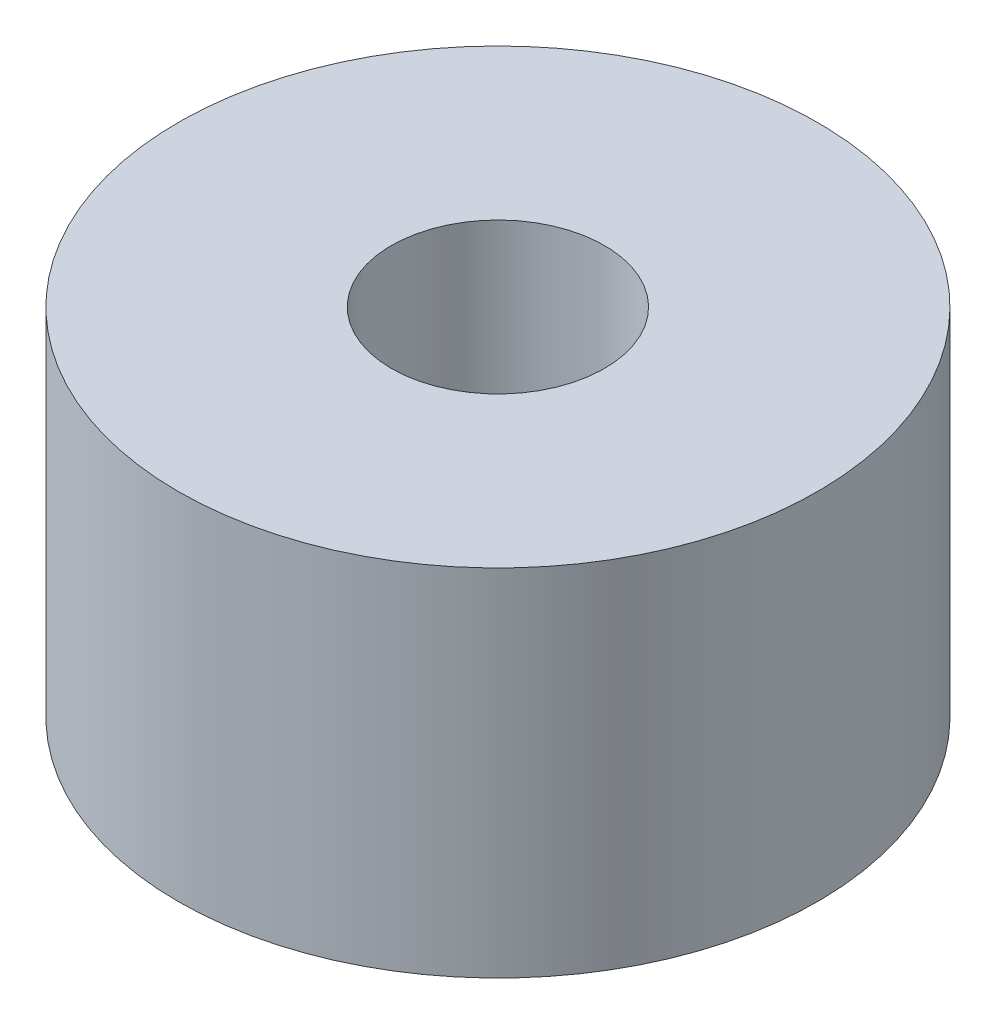
ISO-10303-21;
HEADER;
FILE_DESCRIPTION(('STEP AP214'),'2;1');
FILE_NAME('part.step','',(''),(''),'','','');
FILE_SCHEMA(('AUTOMOTIVE_DESIGN { 1 0 10303 214 1 1 1 1 }'));
ENDSEC;
DATA;
#1=APPLICATION_CONTEXT('core data for automotive mechanical design processes');
#2=APPLICATION_PROTOCOL_DEFINITION('international standard','automotive_design',2000,#1);
#3=PRODUCT_CONTEXT('',#1,'mechanical');
#4=PRODUCT('Part','Part','',(#3));
#5=PRODUCT_RELATED_PRODUCT_CATEGORY('part','',(#4));
#6=PRODUCT_DEFINITION_FORMATION('','',#4);
#7=PRODUCT_DEFINITION_CONTEXT('part definition',#1,'design');
#8=PRODUCT_DEFINITION('design','',#6,#7);
#9=PRODUCT_DEFINITION_SHAPE('','',#8);
#10=(LENGTH_UNIT() NAMED_UNIT(*) SI_UNIT(.MILLI.,.METRE.));
#11=(NAMED_UNIT(*) PLANE_ANGLE_UNIT() SI_UNIT($,.RADIAN.));
#12=(NAMED_UNIT(*) SI_UNIT($,.STERADIAN.) SOLID_ANGLE_UNIT());
#13=UNCERTAINTY_MEASURE_WITH_UNIT(LENGTH_MEASURE(1.E-05),#10,'distance_accuracy_value','');
#14=(GEOMETRIC_REPRESENTATION_CONTEXT(3) GLOBAL_UNCERTAINTY_ASSIGNED_CONTEXT((#13)) GLOBAL_UNIT_ASSIGNED_CONTEXT((#10,
#11,#12)) REPRESENTATION_CONTEXT('',''));
#15=CARTESIAN_POINT('',(0.,0.,0.));
#16=DIRECTION('',(0.,0.,1.));
#17=DIRECTION('',(1.,0.,0.));
#18=AXIS2_PLACEMENT_3D('',#15,#16,#17);
#19=CARTESIAN_POINT('',(0.,5.,0.));
#20=DIRECTION('',(0.,1.,0.));
#21=DIRECTION('',(0.,0.,1.));
#22=AXIS2_PLACEMENT_3D('',#19,#20,#21);
#23=PLANE('',#22);
#24=CARTESIAN_POINT('',(0.,5.,0.));
#25=DIRECTION('',(0.,1.,0.));
#26=DIRECTION('',(0.,0.,1.));
#27=AXIS2_PLACEMENT_3D('',#24,#25,#26);
#28=CIRCLE('',#27,4.5);
#29=CARTESIAN_POINT('',(0.,5.,4.5));
#30=VERTEX_POINT('',#29);
#31=EDGE_CURVE('E10',#30,#30,#28,.T.);
#32=ORIENTED_EDGE('',*,*,#31,.T.);
#33=EDGE_LOOP('',(#32));
#34=FACE_BOUND('',#33,.T.);
#35=CARTESIAN_POINT('',(0.,5.,0.));
#36=DIRECTION('',(0.,1.,0.));
#37=DIRECTION('',(0.,0.,1.));
#38=AXIS2_PLACEMENT_3D('',#35,#36,#37);
#39=CIRCLE('',#38,1.5);
#40=CARTESIAN_POINT('',(0.,5.,1.5));
#41=VERTEX_POINT('',#40);
#42=EDGE_CURVE('E42',#41,#41,#39,.T.);
#43=ORIENTED_EDGE('',*,*,#42,.F.);
#44=EDGE_LOOP('',(#43));
#45=FACE_BOUND('',#44,.T.);
#46=ADVANCED_FACE('F31',(#34,#45),#23,.T.);
#47=CARTESIAN_POINT('',(0.,0.,0.));
#48=DIRECTION('',(0.,1.,0.));
#49=DIRECTION('',(0.,0.,1.));
#50=AXIS2_PLACEMENT_3D('',#47,#48,#49);
#51=PLANE('',#50);
#52=CARTESIAN_POINT('',(0.,0.,0.));
#53=DIRECTION('',(0.,1.,0.));
#54=DIRECTION('',(0.,0.,1.));
#55=AXIS2_PLACEMENT_3D('',#52,#53,#54);
#56=CIRCLE('',#55,4.5);
#57=CARTESIAN_POINT('',(0.,0.,4.5));
#58=VERTEX_POINT('',#57);
#59=EDGE_CURVE('E35',#58,#58,#56,.T.);
#60=ORIENTED_EDGE('',*,*,#59,.F.);
#61=EDGE_LOOP('',(#60));
#62=FACE_BOUND('',#61,.T.);
#63=CARTESIAN_POINT('',(0.,0.,0.));
#64=DIRECTION('',(0.,1.,0.));
#65=DIRECTION('',(0.,0.,1.));
#66=AXIS2_PLACEMENT_3D('',#63,#64,#65);
#67=CIRCLE('',#66,1.5);
#68=CARTESIAN_POINT('',(0.,0.,1.5));
#69=VERTEX_POINT('',#68);
#70=EDGE_CURVE('E44',#69,#69,#67,.T.);
#71=ORIENTED_EDGE('',*,*,#70,.T.);
#72=EDGE_LOOP('',(#71));
#73=FACE_BOUND('',#72,.T.);
#74=ADVANCED_FACE('F54',(#62,#73),#51,.F.);
#75=CARTESIAN_POINT('',(0.,5.,0.));
#76=DIRECTION('',(0.,-1.,0.));
#77=DIRECTION('',(0.,0.,-1.));
#78=AXIS2_PLACEMENT_3D('',#75,#76,#77);
#79=CYLINDRICAL_SURFACE('',#78,4.5);
#80=ORIENTED_EDGE('',*,*,#31,.F.);
#81=EDGE_LOOP('',(#80));
#82=FACE_BOUND('',#81,.T.);
#83=ORIENTED_EDGE('',*,*,#59,.T.);
#84=EDGE_LOOP('',(#83));
#85=FACE_BOUND('',#84,.T.);
#86=ADVANCED_FACE('F33',(#82,#85),#79,.T.);
#87=CARTESIAN_POINT('',(0.,5.,0.));
#88=DIRECTION('',(0.,-1.,0.));
#89=DIRECTION('',(0.,0.,-1.));
#90=AXIS2_PLACEMENT_3D('',#87,#88,#89);
#91=CYLINDRICAL_SURFACE('',#90,1.5);
#92=ORIENTED_EDGE('',*,*,#42,.T.);
#93=EDGE_LOOP('',(#92));
#94=FACE_BOUND('',#93,.T.);
#95=ORIENTED_EDGE('',*,*,#70,.F.);
#96=EDGE_LOOP('',(#95));
#97=FACE_BOUND('',#96,.T.);
#98=ADVANCED_FACE('F50',(#94,#97),#91,.F.);
#99=CLOSED_SHELL('',(#46,#74,#86,#98));
#100=MANIFOLD_SOLID_BREP('B2',#99);
#101=ADVANCED_BREP_SHAPE_REPRESENTATION('',(#18,#100),#14);
#102=SHAPE_DEFINITION_REPRESENTATION(#9,#101);
ENDSEC;
END-ISO-10303-21;
